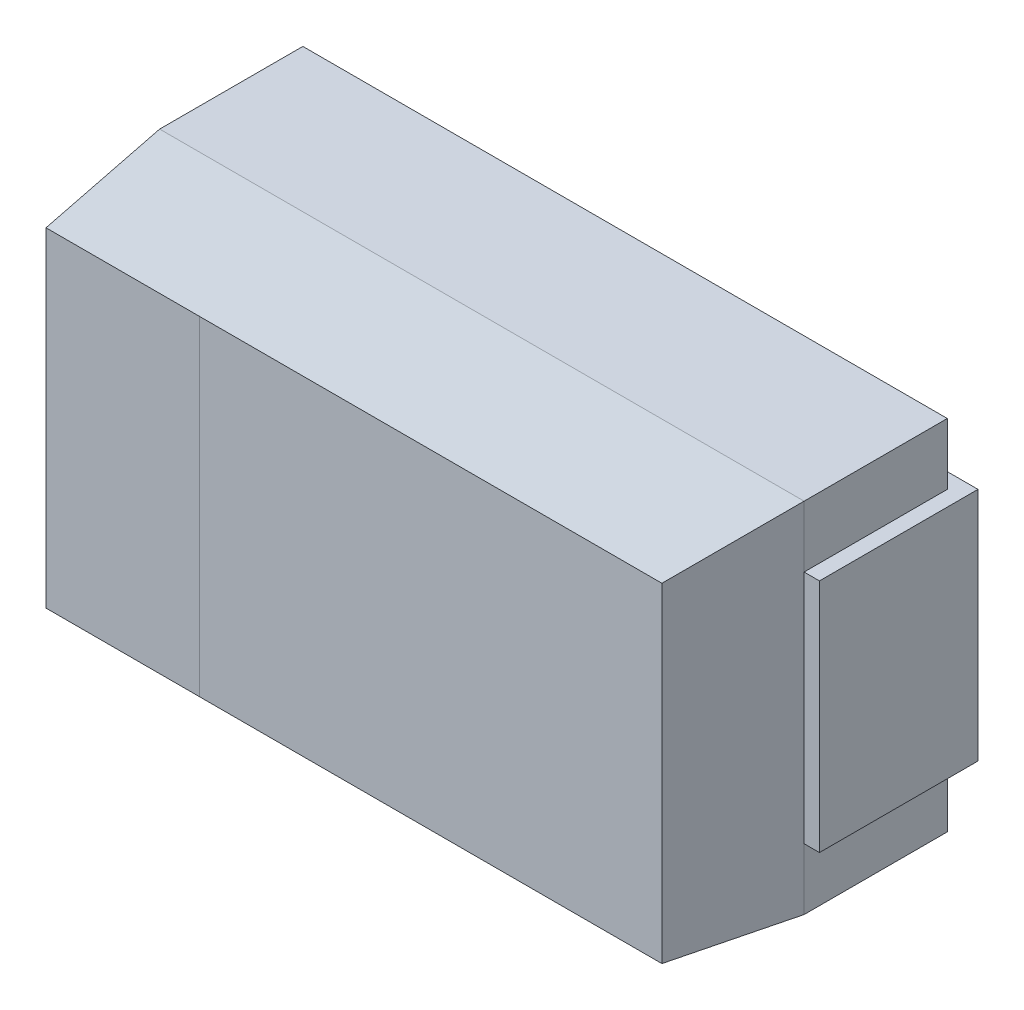
ISO-10303-21;
HEADER;
FILE_DESCRIPTION(('STEP AP214'),'2;1');
FILE_NAME('part.step','',(''),(''),'','','');
FILE_SCHEMA(('AUTOMOTIVE_DESIGN { 1 0 10303 214 1 1 1 1 }'));
ENDSEC;
DATA;
#1=APPLICATION_CONTEXT('core data for automotive mechanical design processes');
#2=APPLICATION_PROTOCOL_DEFINITION('international standard','automotive_design',2000,#1);
#3=PRODUCT_CONTEXT('',#1,'mechanical');
#4=PRODUCT('Part','Part','',(#3));
#5=PRODUCT_RELATED_PRODUCT_CATEGORY('part','',(#4));
#6=PRODUCT_DEFINITION_FORMATION('','',#4);
#7=PRODUCT_DEFINITION_CONTEXT('part definition',#1,'design');
#8=PRODUCT_DEFINITION('design','',#6,#7);
#9=PRODUCT_DEFINITION_SHAPE('','',#8);
#10=(LENGTH_UNIT() NAMED_UNIT(*) SI_UNIT(.MILLI.,.METRE.));
#11=(NAMED_UNIT(*) PLANE_ANGLE_UNIT() SI_UNIT($,.RADIAN.));
#12=(NAMED_UNIT(*) SI_UNIT($,.STERADIAN.) SOLID_ANGLE_UNIT());
#13=UNCERTAINTY_MEASURE_WITH_UNIT(LENGTH_MEASURE(1.E-05),#10,'distance_accuracy_value','');
#14=(GEOMETRIC_REPRESENTATION_CONTEXT(3) GLOBAL_UNCERTAINTY_ASSIGNED_CONTEXT((#13)) GLOBAL_UNIT_ASSIGNED_CONTEXT((#10,
#11,#12)) REPRESENTATION_CONTEXT('',''));
#15=CARTESIAN_POINT('',(0.,0.,0.));
#16=DIRECTION('',(0.,0.,1.));
#17=DIRECTION('',(1.,0.,0.));
#18=AXIS2_PLACEMENT_3D('',#15,#16,#17);
#19=CARTESIAN_POINT('',(-3.301,-1.151,0.));
#20=DIRECTION('',(0.,0.,-1.));
#21=DIRECTION('',(0.,1.,0.));
#22=AXIS2_PLACEMENT_3D('',#19,#20,#21);
#23=PLANE('',#22);
#24=DIRECTION('',(0.,1.,0.));
#25=VECTOR('',#24,1.);
#26=CARTESIAN_POINT('',(-1.7,0.,0.));
#27=LINE('',#26,#25);
#28=CARTESIAN_POINT('',(-1.7,-1.15,0.));
#29=VERTEX_POINT('',#28);
#30=CARTESIAN_POINT('',(-1.7,1.15,0.));
#31=VERTEX_POINT('',#30);
#32=EDGE_CURVE('E316',#29,#31,#27,.T.);
#33=ORIENTED_EDGE('',*,*,#32,.F.);
#34=DIRECTION('',(1.,0.,0.));
#35=VECTOR('',#34,1.);
#36=CARTESIAN_POINT('',(-2.5,-1.15,0.));
#37=LINE('',#36,#35);
#38=CARTESIAN_POINT('',(-3.3,-1.15,0.));
#39=VERTEX_POINT('',#38);
#40=EDGE_CURVE('E317',#39,#29,#37,.T.);
#41=ORIENTED_EDGE('',*,*,#40,.F.);
#42=DIRECTION('',(0.,-1.,0.));
#43=VECTOR('',#42,1.);
#44=CARTESIAN_POINT('',(-3.3,0.,0.));
#45=LINE('',#44,#43);
#46=CARTESIAN_POINT('',(-3.3,1.15,0.));
#47=VERTEX_POINT('',#46);
#48=EDGE_CURVE('E320',#47,#39,#45,.T.);
#49=ORIENTED_EDGE('',*,*,#48,.F.);
#50=DIRECTION('',(1.,0.,0.));
#51=VECTOR('',#50,1.);
#52=CARTESIAN_POINT('',(-2.5,1.15,0.));
#53=LINE('',#52,#51);
#54=EDGE_CURVE('E323',#47,#31,#53,.T.);
#55=ORIENTED_EDGE('',*,*,#54,.T.);
#56=EDGE_LOOP('',(#33,#41,#49,#55));
#57=FACE_BOUND('',#56,.T.);
#58=ADVANCED_FACE('F16',(#57),#23,.T.);
#59=CARTESIAN_POINT('',(-3.3,1.151,-0.001));
#60=DIRECTION('',(-1.,0.,0.));
#61=DIRECTION('',(0.,-1.,0.));
#62=AXIS2_PLACEMENT_3D('',#59,#60,#61);
#63=PLANE('',#62);
#64=DIRECTION('',(0.,-1.,0.));
#65=VECTOR('',#64,1.);
#66=CARTESIAN_POINT('',(-3.3,0.,1.55));
#67=LINE('',#66,#65);
#68=CARTESIAN_POINT('',(-3.3,1.15,1.55));
#69=VERTEX_POINT('',#68);
#70=CARTESIAN_POINT('',(-3.3,-1.15,1.55));
#71=VERTEX_POINT('',#70);
#72=EDGE_CURVE('E276',#69,#71,#67,.T.);
#73=ORIENTED_EDGE('',*,*,#72,.F.);
#74=DIRECTION('',(0.,0.,1.));
#75=VECTOR('',#74,1.);
#76=CARTESIAN_POINT('',(-3.3,1.15,0.775));
#77=LINE('',#76,#75);
#78=EDGE_CURVE('E302',#47,#69,#77,.T.);
#79=ORIENTED_EDGE('',*,*,#78,.F.);
#80=ORIENTED_EDGE('',*,*,#48,.T.);
#81=DIRECTION('',(0.,0.,-1.));
#82=VECTOR('',#81,1.);
#83=CARTESIAN_POINT('',(-3.3,-1.15,0.775));
#84=LINE('',#83,#82);
#85=EDGE_CURVE('E313',#71,#39,#84,.T.);
#86=ORIENTED_EDGE('',*,*,#85,.F.);
#87=EDGE_LOOP('',(#73,#79,#80,#86));
#88=FACE_BOUND('',#87,.T.);
#89=ADVANCED_FACE('F793',(#88),#63,.T.);
#90=CARTESIAN_POINT('',(-3.301,-1.15,-0.001));
#91=DIRECTION('',(0.,-1.,0.));
#92=DIRECTION('',(1.,0.,0.));
#93=AXIS2_PLACEMENT_3D('',#90,#91,#92);
#94=PLANE('',#93);
#95=DIRECTION('',(1.,0.,0.));
#96=VECTOR('',#95,1.);
#97=CARTESIAN_POINT('',(-3.225,-1.15,1.55));
#98=LINE('',#97,#96);
#99=CARTESIAN_POINT('',(-3.15,-1.15,1.55));
#100=VERTEX_POINT('',#99);
#101=EDGE_CURVE('E273',#71,#100,#98,.T.);
#102=ORIENTED_EDGE('',*,*,#101,.F.);
#103=ORIENTED_EDGE('',*,*,#85,.T.);
#104=ORIENTED_EDGE('',*,*,#40,.T.);
#105=DIRECTION('',(0.,0.,-1.));
#106=VECTOR('',#105,1.);
#107=CARTESIAN_POINT('',(-1.7,-1.15,0.075));
#108=LINE('',#107,#106);
#109=CARTESIAN_POINT('',(-1.7,-1.15,0.15));
#110=VERTEX_POINT('',#109);
#111=EDGE_CURVE('E306',#110,#29,#108,.T.);
#112=ORIENTED_EDGE('',*,*,#111,.F.);
#113=DIRECTION('',(1.,0.,0.));
#114=VECTOR('',#113,1.);
#115=CARTESIAN_POINT('',(0.,-1.15,0.15));
#116=LINE('',#115,#114);
#117=CARTESIAN_POINT('',(-3.15,-1.15,0.15));
#118=VERTEX_POINT('',#117);
#119=EDGE_CURVE('E226',#118,#110,#116,.T.);
#120=ORIENTED_EDGE('',*,*,#119,.F.);
#121=DIRECTION('',(0.,0.,-1.));
#122=VECTOR('',#121,1.);
#123=CARTESIAN_POINT('',(-3.15,-1.15,0.85));
#124=LINE('',#123,#122);
#125=EDGE_CURVE('E264',#100,#118,#124,.T.);
#126=ORIENTED_EDGE('',*,*,#125,.F.);
#127=EDGE_LOOP('',(#102,#103,#104,#112,#120,#126));
#128=FACE_BOUND('',#127,.T.);
#129=ADVANCED_FACE('F611',(#128),#94,.T.);
#130=CARTESIAN_POINT('',(-1.7,-1.151,-0.001));
#131=DIRECTION('',(1.,0.,0.));
#132=DIRECTION('',(0.,1.,0.));
#133=AXIS2_PLACEMENT_3D('',#130,#131,#132);
#134=PLANE('',#133);
#135=DIRECTION('',(0.,1.,0.));
#136=VECTOR('',#135,1.);
#137=CARTESIAN_POINT('',(-1.7,0.,0.15));
#138=LINE('',#137,#136);
#139=CARTESIAN_POINT('',(-1.7,1.15,0.15));
#140=VERTEX_POINT('',#139);
#141=EDGE_CURVE('E222',#110,#140,#138,.T.);
#142=ORIENTED_EDGE('',*,*,#141,.F.);
#143=ORIENTED_EDGE('',*,*,#111,.T.);
#144=ORIENTED_EDGE('',*,*,#32,.T.);
#145=DIRECTION('',(0.,0.,-1.));
#146=VECTOR('',#145,1.);
#147=CARTESIAN_POINT('',(-1.7,1.15,0.775));
#148=LINE('',#147,#146);
#149=EDGE_CURVE('E305',#140,#31,#148,.T.);
#150=ORIENTED_EDGE('',*,*,#149,.F.);
#151=EDGE_LOOP('',(#142,#143,#144,#150));
#152=FACE_BOUND('',#151,.T.);
#153=ADVANCED_FACE('F613',(#152),#134,.T.);
#154=CARTESIAN_POINT('',(-1.699,1.15,-0.001));
#155=DIRECTION('',(0.,1.,0.));
#156=DIRECTION('',(-1.,0.,0.));
#157=AXIS2_PLACEMENT_3D('',#154,#155,#156);
#158=PLANE('',#157);
#159=DIRECTION('',(-1.,0.,0.));
#160=VECTOR('',#159,1.);
#161=CARTESIAN_POINT('',(0.,1.15,0.15));
#162=LINE('',#161,#160);
#163=CARTESIAN_POINT('',(-3.15,1.15,0.15));
#164=VERTEX_POINT('',#163);
#165=EDGE_CURVE('E225',#140,#164,#162,.T.);
#166=ORIENTED_EDGE('',*,*,#165,.F.);
#167=ORIENTED_EDGE('',*,*,#149,.T.);
#168=ORIENTED_EDGE('',*,*,#54,.F.);
#169=ORIENTED_EDGE('',*,*,#78,.T.);
#170=DIRECTION('',(-1.,0.,0.));
#171=VECTOR('',#170,1.);
#172=CARTESIAN_POINT('',(-3.225,1.15,1.55));
#173=LINE('',#172,#171);
#174=CARTESIAN_POINT('',(-3.15,1.15,1.55));
#175=VERTEX_POINT('',#174);
#176=EDGE_CURVE('E266',#175,#69,#173,.T.);
#177=ORIENTED_EDGE('',*,*,#176,.F.);
#178=DIRECTION('',(0.,0.,1.));
#179=VECTOR('',#178,1.);
#180=CARTESIAN_POINT('',(-3.15,1.15,0.85));
#181=LINE('',#180,#179);
#182=EDGE_CURVE('E235',#164,#175,#181,.T.);
#183=ORIENTED_EDGE('',*,*,#182,.F.);
#184=EDGE_LOOP('',(#166,#167,#168,#169,#177,#183));
#185=FACE_BOUND('',#184,.T.);
#186=ADVANCED_FACE('F614',(#185),#158,.T.);
#187=CARTESIAN_POINT('',(-3.301,1.151,1.55));
#188=DIRECTION('',(0.,0.,1.));
#189=DIRECTION('',(0.,-1.,0.));
#190=AXIS2_PLACEMENT_3D('',#187,#188,#189);
#191=PLANE('',#190);
#192=DIRECTION('',(0.,-1.,0.));
#193=VECTOR('',#192,1.);
#194=CARTESIAN_POINT('',(-3.15,0.,1.55));
#195=LINE('',#194,#193);
#196=EDGE_CURVE('E246',#175,#100,#195,.T.);
#197=ORIENTED_EDGE('',*,*,#196,.F.);
#198=ORIENTED_EDGE('',*,*,#176,.T.);
#199=ORIENTED_EDGE('',*,*,#72,.T.);
#200=ORIENTED_EDGE('',*,*,#101,.T.);
#201=EDGE_LOOP('',(#197,#198,#199,#200));
#202=FACE_BOUND('',#201,.T.);
#203=ADVANCED_FACE('F590',(#202),#191,.T.);
#204=CARTESIAN_POINT('',(-3.15,-1.149,1.551));
#205=DIRECTION('',(-1.,0.,0.));
#206=DIRECTION('',(0.,0.,-1.));
#207=AXIS2_PLACEMENT_3D('',#204,#205,#206);
#208=PLANE('',#207);
#209=DIRECTION('',(0.,0.,-1.));
#210=VECTOR('',#209,1.);
#211=CARTESIAN_POINT('',(-3.15,-1.75,0.85));
#212=LINE('',#211,#210);
#213=CARTESIAN_POINT('',(-3.15,-1.75,1.55));
#214=VERTEX_POINT('',#213);
#215=CARTESIAN_POINT('',(-3.15,-1.75,0.15));
#216=VERTEX_POINT('',#215);
#217=EDGE_CURVE('E216',#214,#216,#212,.T.);
#218=ORIENTED_EDGE('',*,*,#217,.F.);
#219=DIRECTION('',(0.,-1.,0.));
#220=VECTOR('',#219,1.);
#221=CARTESIAN_POINT('',(-3.15,0.,1.55));
#222=LINE('',#221,#220);
#223=EDGE_CURVE('E258',#100,#214,#222,.T.);
#224=ORIENTED_EDGE('',*,*,#223,.F.);
#225=ORIENTED_EDGE('',*,*,#125,.T.);
#226=DIRECTION('',(0.,1.,0.));
#227=VECTOR('',#226,1.);
#228=CARTESIAN_POINT('',(-3.15,0.,0.15));
#229=LINE('',#228,#227);
#230=EDGE_CURVE('E229',#216,#118,#229,.T.);
#231=ORIENTED_EDGE('',*,*,#230,.F.);
#232=EDGE_LOOP('',(#218,#224,#225,#231));
#233=FACE_BOUND('',#232,.T.);
#234=ADVANCED_FACE('F596',(#233),#208,.T.);
#235=CARTESIAN_POINT('',(-3.15,1.751,1.551));
#236=DIRECTION('',(-1.,0.,0.));
#237=DIRECTION('',(0.,0.,-1.));
#238=AXIS2_PLACEMENT_3D('',#235,#236,#237);
#239=PLANE('',#238);
#240=DIRECTION('',(0.,0.,1.));
#241=VECTOR('',#240,1.);
#242=CARTESIAN_POINT('',(-3.15,1.75,0.85));
#243=LINE('',#242,#241);
#244=CARTESIAN_POINT('',(-3.15,1.75,0.15));
#245=VERTEX_POINT('',#244);
#246=CARTESIAN_POINT('',(-3.15,1.75,1.55));
#247=VERTEX_POINT('',#246);
#248=EDGE_CURVE('E209',#245,#247,#243,.T.);
#249=ORIENTED_EDGE('',*,*,#248,.F.);
#250=DIRECTION('',(0.,1.,0.));
#251=VECTOR('',#250,1.);
#252=CARTESIAN_POINT('',(-3.15,0.,0.15));
#253=LINE('',#252,#251);
#254=EDGE_CURVE('E221',#164,#245,#253,.T.);
#255=ORIENTED_EDGE('',*,*,#254,.F.);
#256=ORIENTED_EDGE('',*,*,#182,.T.);
#257=DIRECTION('',(0.,-1.,0.));
#258=VECTOR('',#257,1.);
#259=CARTESIAN_POINT('',(-3.15,0.,1.55));
#260=LINE('',#259,#258);
#261=EDGE_CURVE('E220',#247,#175,#260,.T.);
#262=ORIENTED_EDGE('',*,*,#261,.F.);
#263=EDGE_LOOP('',(#249,#255,#256,#262));
#264=FACE_BOUND('',#263,.T.);
#265=ADVANCED_FACE('F586',(#264),#239,.T.);
#266=CARTESIAN_POINT('',(-3.151,-1.751,0.15));
#267=DIRECTION('',(0.,0.,-1.));
#268=DIRECTION('',(0.,1.,0.));
#269=AXIS2_PLACEMENT_3D('',#266,#267,#268);
#270=PLANE('',#269);
#271=DIRECTION('',(-1.,0.,0.));
#272=VECTOR('',#271,1.);
#273=CARTESIAN_POINT('',(0.,1.75,0.15));
#274=LINE('',#273,#272);
#275=CARTESIAN_POINT('',(3.15,1.75,0.15));
#276=VERTEX_POINT('',#275);
#277=EDGE_CURVE('E210',#276,#245,#274,.T.);
#278=ORIENTED_EDGE('',*,*,#277,.F.);
#279=DIRECTION('',(0.,-1.,0.));
#280=VECTOR('',#279,1.);
#281=CARTESIAN_POINT('',(3.15,0.,0.15));
#282=LINE('',#281,#280);
#283=CARTESIAN_POINT('',(3.15,1.15,0.15));
#284=VERTEX_POINT('',#283);
#285=EDGE_CURVE('E217',#276,#284,#282,.T.);
#286=ORIENTED_EDGE('',*,*,#285,.T.);
#287=DIRECTION('',(-1.,0.,0.));
#288=VECTOR('',#287,1.);
#289=CARTESIAN_POINT('',(0.,1.15,0.15));
#290=LINE('',#289,#288);
#291=CARTESIAN_POINT('',(1.7,1.15,0.15));
#292=VERTEX_POINT('',#291);
#293=EDGE_CURVE('E233',#284,#292,#290,.T.);
#294=ORIENTED_EDGE('',*,*,#293,.T.);
#295=DIRECTION('',(0.,1.,0.));
#296=VECTOR('',#295,1.);
#297=CARTESIAN_POINT('',(1.7,0.,0.15));
#298=LINE('',#297,#296);
#299=CARTESIAN_POINT('',(1.7,-1.15,0.15));
#300=VERTEX_POINT('',#299);
#301=EDGE_CURVE('E203',#300,#292,#298,.T.);
#302=ORIENTED_EDGE('',*,*,#301,.F.);
#303=DIRECTION('',(1.,0.,0.));
#304=VECTOR('',#303,1.);
#305=CARTESIAN_POINT('',(0.,-1.15,0.15));
#306=LINE('',#305,#304);
#307=CARTESIAN_POINT('',(3.15,-1.15,0.15));
#308=VERTEX_POINT('',#307);
#309=EDGE_CURVE('E230',#300,#308,#306,.T.);
#310=ORIENTED_EDGE('',*,*,#309,.T.);
#311=DIRECTION('',(0.,-1.,0.));
#312=VECTOR('',#311,1.);
#313=CARTESIAN_POINT('',(3.15,0.,0.15));
#314=LINE('',#313,#312);
#315=CARTESIAN_POINT('',(3.15,-1.75,0.15));
#316=VERTEX_POINT('',#315);
#317=EDGE_CURVE('E227',#308,#316,#314,.T.);
#318=ORIENTED_EDGE('',*,*,#317,.T.);
#319=DIRECTION('',(1.,0.,0.));
#320=VECTOR('',#319,1.);
#321=CARTESIAN_POINT('',(0.,-1.75,0.15));
#322=LINE('',#321,#320);
#323=EDGE_CURVE('E213',#216,#316,#322,.T.);
#324=ORIENTED_EDGE('',*,*,#323,.F.);
#325=ORIENTED_EDGE('',*,*,#230,.T.);
#326=ORIENTED_EDGE('',*,*,#119,.T.);
#327=ORIENTED_EDGE('',*,*,#141,.T.);
#328=ORIENTED_EDGE('',*,*,#165,.T.);
#329=ORIENTED_EDGE('',*,*,#254,.T.);
#330=EDGE_LOOP('',(#278,#286,#294,#302,#310,#318,#324,#325,#326,#327,#328,#329));
#331=FACE_BOUND('',#330,.T.);
#332=ADVANCED_FACE('F364',(#331),#270,.T.);
#333=CARTESIAN_POINT('',(-3.00988869592355,1.751,2.80099378639685));
#334=DIRECTION('',(-0.993786396851058,0.,0.111304076447324));
#335=DIRECTION('',(-0.111304076447324,0.,-0.993786396851058));
#336=AXIS2_PLACEMENT_3D('',#333,#334,#335);
#337=PLANE('',#336);
#338=CARTESIAN_POINT('',(-3.00977877504582,1.61,2.802));
#339=DIRECTION('',(0.,-1.,0.));
#340=VECTOR('',#339,1.);
#341=LINE('',#338,#340);
#342=CARTESIAN_POINT('',(-3.0099631291743,1.61,2.80099587046752));
#343=VERTEX_POINT('',#342);
#344=CARTESIAN_POINT('',(-3.00992625834861,-1.61,2.80099587046752));
#345=VERTEX_POINT('',#344);
#346=EDGE_CURVE('E347',#343,#345,#341,.T.);
#347=ORIENTED_EDGE('',*,*,#346,.F.);
#348=CARTESIAN_POINT('',(-3.01,1.61,2.8));
#349=DIRECTION('',(-0.110620966319341,0.110620966319337,-0.987687199279788));
#350=VECTOR('',#349,1.);
#351=LINE('',#348,#350);
#352=EDGE_CURVE('E176',#343,#247,#351,.T.);
#353=ORIENTED_EDGE('',*,*,#352,.T.);
#354=ORIENTED_EDGE('',*,*,#261,.T.);
#355=ORIENTED_EDGE('',*,*,#196,.T.);
#356=ORIENTED_EDGE('',*,*,#223,.T.);
#357=CARTESIAN_POINT('',(-3.15,-1.75,1.55));
#358=DIRECTION('',(0.110620966319341,0.110620966319336,0.987687199279788));
#359=VECTOR('',#358,1.);
#360=LINE('',#357,#359);
#361=EDGE_CURVE('E261',#214,#345,#360,.T.);
#362=ORIENTED_EDGE('',*,*,#361,.T.);
#363=EDGE_LOOP('',(#347,#353,#354,#355,#356,#362));
#364=FACE_BOUND('',#363,.T.);
#365=ADVANCED_FACE('F353',(#364),#337,.T.);
#366=CARTESIAN_POINT('',(-3.151,-1.75,1.551));
#367=DIRECTION('',(0.,-1.,0.));
#368=DIRECTION('',(0.,0.,-1.));
#369=AXIS2_PLACEMENT_3D('',#366,#367,#368);
#370=PLANE('',#369);
#371=ORIENTED_EDGE('',*,*,#323,.T.);
#372=DIRECTION('',(0.,0.,-1.));
#373=VECTOR('',#372,1.);
#374=CARTESIAN_POINT('',(3.15,-1.75,0.85));
#375=LINE('',#374,#373);
#376=CARTESIAN_POINT('',(3.15,-1.75,1.55));
#377=VERTEX_POINT('',#376);
#378=EDGE_CURVE('E455',#377,#316,#375,.T.);
#379=ORIENTED_EDGE('',*,*,#378,.F.);
#380=DIRECTION('',(1.,0.,0.));
#381=VECTOR('',#380,1.);
#382=CARTESIAN_POINT('',(0.,-1.75,1.55));
#383=LINE('',#382,#381);
#384=EDGE_CURVE('E249',#214,#377,#383,.T.);
#385=ORIENTED_EDGE('',*,*,#384,.F.);
#386=ORIENTED_EDGE('',*,*,#217,.T.);
#387=EDGE_LOOP('',(#371,#379,#385,#386));
#388=FACE_BOUND('',#387,.T.);
#389=ADVANCED_FACE('F363',(#388),#370,.T.);
#390=CARTESIAN_POINT('',(-3.151,1.75,0.149));
#391=DIRECTION('',(0.,1.,0.));
#392=DIRECTION('',(0.,0.,1.));
#393=AXIS2_PLACEMENT_3D('',#390,#391,#392);
#394=PLANE('',#393);
#395=ORIENTED_EDGE('',*,*,#277,.T.);
#396=ORIENTED_EDGE('',*,*,#248,.T.);
#397=DIRECTION('',(-1.,0.,0.));
#398=VECTOR('',#397,1.);
#399=CARTESIAN_POINT('',(0.,1.75,1.55));
#400=LINE('',#399,#398);
#401=CARTESIAN_POINT('',(3.15,1.75,1.55));
#402=VERTEX_POINT('',#401);
#403=EDGE_CURVE('E236',#402,#247,#400,.T.);
#404=ORIENTED_EDGE('',*,*,#403,.F.);
#405=DIRECTION('',(0.,0.,1.));
#406=VECTOR('',#405,1.);
#407=CARTESIAN_POINT('',(3.15,1.75,0.85));
#408=LINE('',#407,#406);
#409=EDGE_CURVE('E202',#276,#402,#408,.T.);
#410=ORIENTED_EDGE('',*,*,#409,.F.);
#411=EDGE_LOOP('',(#395,#396,#404,#410));
#412=FACE_BOUND('',#411,.T.);
#413=ADVANCED_FACE('F583',(#412),#394,.T.);
#414=CARTESIAN_POINT('',(1.7,1.151,-0.001));
#415=DIRECTION('',(-1.,0.,0.));
#416=DIRECTION('',(0.,-1.,0.));
#417=AXIS2_PLACEMENT_3D('',#414,#415,#416);
#418=PLANE('',#417);
#419=ORIENTED_EDGE('',*,*,#301,.T.);
#420=DIRECTION('',(0.,0.,-1.));
#421=VECTOR('',#420,1.);
#422=CARTESIAN_POINT('',(1.7,1.15,0.075));
#423=LINE('',#422,#421);
#424=CARTESIAN_POINT('',(1.7,1.15,0.));
#425=VERTEX_POINT('',#424);
#426=EDGE_CURVE('E200',#292,#425,#423,.T.);
#427=ORIENTED_EDGE('',*,*,#426,.T.);
#428=DIRECTION('',(0.,1.,0.));
#429=VECTOR('',#428,1.);
#430=CARTESIAN_POINT('',(1.7,0.,0.));
#431=LINE('',#430,#429);
#432=CARTESIAN_POINT('',(1.7,-1.15,0.));
#433=VERTEX_POINT('',#432);
#434=EDGE_CURVE('E194',#433,#425,#431,.T.);
#435=ORIENTED_EDGE('',*,*,#434,.F.);
#436=DIRECTION('',(0.,0.,1.));
#437=VECTOR('',#436,1.);
#438=CARTESIAN_POINT('',(1.7,-1.15,0.075));
#439=LINE('',#438,#437);
#440=EDGE_CURVE('E206',#433,#300,#439,.T.);
#441=ORIENTED_EDGE('',*,*,#440,.T.);
#442=EDGE_LOOP('',(#419,#427,#435,#441));
#443=FACE_BOUND('',#442,.T.);
#444=ADVANCED_FACE('F571',(#443),#418,.T.);
#445=CARTESIAN_POINT('',(3.15,1.751,0.149));
#446=DIRECTION('',(1.,0.,0.));
#447=DIRECTION('',(0.,0.,1.));
#448=AXIS2_PLACEMENT_3D('',#445,#446,#447);
#449=PLANE('',#448);
#450=ORIENTED_EDGE('',*,*,#409,.T.);
#451=DIRECTION('',(0.,-1.,0.));
#452=VECTOR('',#451,1.);
#453=CARTESIAN_POINT('',(3.15,1.45,1.55));
#454=LINE('',#453,#452);
#455=CARTESIAN_POINT('',(3.15,1.15,1.55));
#456=VERTEX_POINT('',#455);
#457=EDGE_CURVE('E468',#402,#456,#454,.T.);
#458=ORIENTED_EDGE('',*,*,#457,.T.);
#459=DIRECTION('',(0.,0.,1.));
#460=VECTOR('',#459,1.);
#461=CARTESIAN_POINT('',(3.15,1.15,0.775));
#462=LINE('',#461,#460);
#463=EDGE_CURVE('E562',#284,#456,#462,.T.);
#464=ORIENTED_EDGE('',*,*,#463,.F.);
#465=ORIENTED_EDGE('',*,*,#285,.F.);
#466=EDGE_LOOP('',(#450,#458,#464,#465));
#467=FACE_BOUND('',#466,.T.);
#468=ADVANCED_FACE('F577',(#467),#449,.T.);
#469=CARTESIAN_POINT('',(3.15,-1.149,0.149));
#470=DIRECTION('',(1.,0.,0.));
#471=DIRECTION('',(0.,0.,1.));
#472=AXIS2_PLACEMENT_3D('',#469,#470,#471);
#473=PLANE('',#472);
#474=ORIENTED_EDGE('',*,*,#378,.T.);
#475=ORIENTED_EDGE('',*,*,#317,.F.);
#476=DIRECTION('',(0.,0.,-1.));
#477=VECTOR('',#476,1.);
#478=CARTESIAN_POINT('',(3.15,-1.15,0.775));
#479=LINE('',#478,#477);
#480=CARTESIAN_POINT('',(3.15,-1.15,1.55));
#481=VERTEX_POINT('',#480);
#482=EDGE_CURVE('E164',#481,#308,#479,.T.);
#483=ORIENTED_EDGE('',*,*,#482,.F.);
#484=DIRECTION('',(0.,-1.,0.));
#485=VECTOR('',#484,1.);
#486=CARTESIAN_POINT('',(3.15,-1.45,1.55));
#487=LINE('',#486,#485);
#488=EDGE_CURVE('E463',#481,#377,#487,.T.);
#489=ORIENTED_EDGE('',*,*,#488,.T.);
#490=EDGE_LOOP('',(#474,#475,#483,#489));
#491=FACE_BOUND('',#490,.T.);
#492=ADVANCED_FACE('F401',(#491),#473,.T.);
#493=CARTESIAN_POINT('',(-3.011,1.611,2.802));
#494=DIRECTION('',(0.,0.,1.));
#495=DIRECTION('',(0.,-1.,0.));
#496=AXIS2_PLACEMENT_3D('',#493,#494,#495);
#497=PLANE('',#496);
#498=CARTESIAN_POINT('',(-3.01,1.60977877504582,2.80197522280513));
#499=DIRECTION('',(1.,0.,0.));
#500=VECTOR('',#499,1.);
#501=LINE('',#498,#500);
#502=CARTESIAN_POINT('',(-1.51,1.61,2.8008));
#503=VERTEX_POINT('',#502);
#504=EDGE_CURVE('E157',#343,#503,#501,.T.);
#505=ORIENTED_EDGE('',*,*,#504,.F.);
#506=ORIENTED_EDGE('',*,*,#346,.T.);
#507=CARTESIAN_POINT('',(-1.51,-1.60977877504582,2.80197522280513));
#508=DIRECTION('',(-1.,0.,0.));
#509=VECTOR('',#508,1.);
#510=LINE('',#507,#509);
#511=CARTESIAN_POINT('',(-1.51,-1.61,2.8008));
#512=VERTEX_POINT('',#511);
#513=EDGE_CURVE('E148',#512,#345,#510,.T.);
#514=ORIENTED_EDGE('',*,*,#513,.F.);
#515=CARTESIAN_POINT('',(-1.51,1.61,2.8));
#516=DIRECTION('',(0.,-1.,0.));
#517=VECTOR('',#516,1.);
#518=LINE('',#515,#517);
#519=EDGE_CURVE('E153',#503,#512,#518,.T.);
#520=ORIENTED_EDGE('',*,*,#519,.F.);
#521=EDGE_LOOP('',(#505,#506,#514,#520));
#522=FACE_BOUND('',#521,.T.);
#523=ADVANCED_FACE('F156',(#522),#497,.T.);
#524=CARTESIAN_POINT('',(-3.151,-1.60988869592355,2.80099378639685));
#525=DIRECTION('',(0.,-0.993786396851058,0.111304076447323));
#526=DIRECTION('',(0.,-0.111304076447323,-0.993786396851058));
#527=AXIS2_PLACEMENT_3D('',#524,#525,#526);
#528=PLANE('',#527);
#529=ORIENTED_EDGE('',*,*,#384,.T.);
#530=CARTESIAN_POINT('',(3.15,-1.75,1.55));
#531=DIRECTION('',(-0.110620966319337,0.110620966319341,0.987687199279788));
#532=VECTOR('',#531,1.);
#533=LINE('',#530,#532);
#534=CARTESIAN_POINT('',(3.01,-1.61,2.8));
#535=VERTEX_POINT('',#534);
#536=EDGE_CURVE('E180',#377,#535,#533,.T.);
#537=ORIENTED_EDGE('',*,*,#536,.T.);
#538=DIRECTION('',(1.,0.,0.));
#539=VECTOR('',#538,1.);
#540=CARTESIAN_POINT('',(0.75,-1.61,2.8));
#541=LINE('',#540,#539);
#542=EDGE_CURVE('E163',#512,#535,#541,.T.);
#543=ORIENTED_EDGE('',*,*,#542,.F.);
#544=ORIENTED_EDGE('',*,*,#513,.T.);
#545=ORIENTED_EDGE('',*,*,#361,.F.);
#546=EDGE_LOOP('',(#529,#537,#543,#544,#545));
#547=FACE_BOUND('',#546,.T.);
#548=ADVANCED_FACE('F400',(#547),#528,.T.);
#549=CARTESIAN_POINT('',(-3.151,1.75011130407645,1.54900621360315));
#550=DIRECTION('',(0.,0.993786396851058,0.111304076447323));
#551=DIRECTION('',(0.,-0.111304076447323,0.993786396851058));
#552=AXIS2_PLACEMENT_3D('',#549,#550,#551);
#553=PLANE('',#552);
#554=ORIENTED_EDGE('',*,*,#403,.T.);
#555=ORIENTED_EDGE('',*,*,#352,.F.);
#556=ORIENTED_EDGE('',*,*,#504,.T.);
#557=DIRECTION('',(-1.,0.,0.));
#558=VECTOR('',#557,1.);
#559=CARTESIAN_POINT('',(0.75,1.61,2.8));
#560=LINE('',#559,#558);
#561=CARTESIAN_POINT('',(3.01,1.61,2.8));
#562=VERTEX_POINT('',#561);
#563=EDGE_CURVE('E173',#562,#503,#560,.T.);
#564=ORIENTED_EDGE('',*,*,#563,.F.);
#565=CARTESIAN_POINT('',(3.01,1.61,2.8));
#566=DIRECTION('',(0.110620966319336,0.110620966319341,-0.987687199279788));
#567=VECTOR('',#566,1.);
#568=LINE('',#565,#567);
#569=EDGE_CURVE('E179',#562,#402,#568,.T.);
#570=ORIENTED_EDGE('',*,*,#569,.T.);
#571=EDGE_LOOP('',(#554,#555,#556,#564,#570));
#572=FACE_BOUND('',#571,.T.);
#573=ADVANCED_FACE('F171',(#572),#553,.T.);
#574=CARTESIAN_POINT('',(1.699,-1.151,0.));
#575=DIRECTION('',(0.,0.,-1.));
#576=DIRECTION('',(0.,1.,0.));
#577=AXIS2_PLACEMENT_3D('',#574,#575,#576);
#578=PLANE('',#577);
#579=ORIENTED_EDGE('',*,*,#434,.T.);
#580=DIRECTION('',(-1.,0.,0.));
#581=VECTOR('',#580,1.);
#582=CARTESIAN_POINT('',(2.5,1.15,0.));
#583=LINE('',#582,#581);
#584=CARTESIAN_POINT('',(3.3,1.15,0.));
#585=VERTEX_POINT('',#584);
#586=EDGE_CURVE('E563',#585,#425,#583,.T.);
#587=ORIENTED_EDGE('',*,*,#586,.F.);
#588=DIRECTION('',(0.,1.,0.));
#589=VECTOR('',#588,1.);
#590=CARTESIAN_POINT('',(3.3,0.,0.));
#591=LINE('',#590,#589);
#592=CARTESIAN_POINT('',(3.3,-1.15,0.));
#593=VERTEX_POINT('',#592);
#594=EDGE_CURVE('E186',#593,#585,#591,.T.);
#595=ORIENTED_EDGE('',*,*,#594,.F.);
#596=DIRECTION('',(1.,0.,0.));
#597=VECTOR('',#596,1.);
#598=CARTESIAN_POINT('',(2.5,-1.15,0.));
#599=LINE('',#598,#597);
#600=EDGE_CURVE('E557',#433,#593,#599,.T.);
#601=ORIENTED_EDGE('',*,*,#600,.F.);
#602=EDGE_LOOP('',(#579,#587,#595,#601));
#603=FACE_BOUND('',#602,.T.);
#604=ADVANCED_FACE('F484',(#603),#578,.T.);
#605=CARTESIAN_POINT('',(3.301,1.15,-0.001));
#606=DIRECTION('',(0.,1.,0.));
#607=DIRECTION('',(-1.,0.,0.));
#608=AXIS2_PLACEMENT_3D('',#605,#606,#607);
#609=PLANE('',#608);
#610=DIRECTION('',(1.,0.,0.));
#611=VECTOR('',#610,1.);
#612=CARTESIAN_POINT('',(2.5,1.15,1.55));
#613=LINE('',#612,#611);
#614=CARTESIAN_POINT('',(3.3,1.15,1.55));
#615=VERTEX_POINT('',#614);
#616=EDGE_CURVE('E36',#456,#615,#613,.T.);
#617=ORIENTED_EDGE('',*,*,#616,.T.);
#618=DIRECTION('',(0.,0.,1.));
#619=VECTOR('',#618,1.);
#620=CARTESIAN_POINT('',(3.3,1.15,0.775));
#621=LINE('',#620,#619);
#622=EDGE_CURVE('E189',#585,#615,#621,.T.);
#623=ORIENTED_EDGE('',*,*,#622,.F.);
#624=ORIENTED_EDGE('',*,*,#586,.T.);
#625=ORIENTED_EDGE('',*,*,#426,.F.);
#626=ORIENTED_EDGE('',*,*,#293,.F.);
#627=ORIENTED_EDGE('',*,*,#463,.T.);
#628=EDGE_LOOP('',(#617,#623,#624,#625,#626,#627));
#629=FACE_BOUND('',#628,.T.);
#630=ADVANCED_FACE('F573',(#629),#609,.T.);
#631=CARTESIAN_POINT('',(1.699,-1.15,-0.001));
#632=DIRECTION('',(0.,-1.,0.));
#633=DIRECTION('',(1.,0.,0.));
#634=AXIS2_PLACEMENT_3D('',#631,#632,#633);
#635=PLANE('',#634);
#636=ORIENTED_EDGE('',*,*,#309,.F.);
#637=ORIENTED_EDGE('',*,*,#440,.F.);
#638=ORIENTED_EDGE('',*,*,#600,.T.);
#639=DIRECTION('',(0.,0.,-1.));
#640=VECTOR('',#639,1.);
#641=CARTESIAN_POINT('',(3.3,-1.15,0.775));
#642=LINE('',#641,#640);
#643=CARTESIAN_POINT('',(3.3,-1.15,1.55));
#644=VERTEX_POINT('',#643);
#645=EDGE_CURVE('E472',#644,#593,#642,.T.);
#646=ORIENTED_EDGE('',*,*,#645,.F.);
#647=DIRECTION('',(-1.,0.,0.));
#648=VECTOR('',#647,1.);
#649=CARTESIAN_POINT('',(2.5,-1.15,1.55));
#650=LINE('',#649,#648);
#651=EDGE_CURVE('E549',#644,#481,#650,.T.);
#652=ORIENTED_EDGE('',*,*,#651,.T.);
#653=ORIENTED_EDGE('',*,*,#482,.T.);
#654=EDGE_LOOP('',(#636,#637,#638,#646,#652,#653));
#655=FACE_BOUND('',#654,.T.);
#656=ADVANCED_FACE('F528',(#655),#635,.T.);
#657=CARTESIAN_POINT('',(-1.511,1.611,2.8));
#658=DIRECTION('',(0.,0.,1.));
#659=DIRECTION('',(0.,-1.,0.));
#660=AXIS2_PLACEMENT_3D('',#657,#658,#659);
#661=PLANE('',#660);
#662=DIRECTION('',(0.,-1.,0.));
#663=VECTOR('',#662,1.);
#664=CARTESIAN_POINT('',(3.01,0.,2.8));
#665=LINE('',#664,#663);
#666=EDGE_CURVE('E185',#562,#535,#665,.T.);
#667=ORIENTED_EDGE('',*,*,#666,.F.);
#668=ORIENTED_EDGE('',*,*,#563,.T.);
#669=ORIENTED_EDGE('',*,*,#519,.T.);
#670=ORIENTED_EDGE('',*,*,#542,.T.);
#671=EDGE_LOOP('',(#667,#668,#669,#670));
#672=FACE_BOUND('',#671,.T.);
#673=ADVANCED_FACE('F183',(#672),#661,.T.);
#674=CARTESIAN_POINT('',(3.3,-1.151,-0.001));
#675=DIRECTION('',(1.,0.,0.));
#676=DIRECTION('',(0.,1.,0.));
#677=AXIS2_PLACEMENT_3D('',#674,#675,#676);
#678=PLANE('',#677);
#679=DIRECTION('',(0.,1.,0.));
#680=VECTOR('',#679,1.);
#681=CARTESIAN_POINT('',(3.3,0.,1.55));
#682=LINE('',#681,#680);
#683=EDGE_CURVE('E27',#644,#615,#682,.T.);
#684=ORIENTED_EDGE('',*,*,#683,.F.);
#685=ORIENTED_EDGE('',*,*,#645,.T.);
#686=ORIENTED_EDGE('',*,*,#594,.T.);
#687=ORIENTED_EDGE('',*,*,#622,.T.);
#688=EDGE_LOOP('',(#684,#685,#686,#687));
#689=FACE_BOUND('',#688,.T.);
#690=ADVANCED_FACE('F527',(#689),#678,.T.);
#691=CARTESIAN_POINT('',(3.15011130407645,1.751,1.54900621360315));
#692=DIRECTION('',(0.993786396851058,0.,0.111304076447324));
#693=DIRECTION('',(-0.111304076447324,0.,0.993786396851058));
#694=AXIS2_PLACEMENT_3D('',#691,#692,#693);
#695=PLANE('',#694);
#696=ORIENTED_EDGE('',*,*,#457,.F.);
#697=ORIENTED_EDGE('',*,*,#569,.F.);
#698=ORIENTED_EDGE('',*,*,#666,.T.);
#699=ORIENTED_EDGE('',*,*,#536,.F.);
#700=ORIENTED_EDGE('',*,*,#488,.F.);
#701=DIRECTION('',(0.,-1.,0.));
#702=VECTOR('',#701,1.);
#703=CARTESIAN_POINT('',(3.15,0.,1.55));
#704=LINE('',#703,#702);
#705=EDGE_CURVE('E11',#456,#481,#704,.T.);
#706=ORIENTED_EDGE('',*,*,#705,.F.);
#707=EDGE_LOOP('',(#696,#697,#698,#699,#700,#706));
#708=FACE_BOUND('',#707,.T.);
#709=ADVANCED_FACE('F530',(#708),#695,.T.);
#710=CARTESIAN_POINT('',(3.149,1.151,1.55));
#711=DIRECTION('',(0.,0.,1.));
#712=DIRECTION('',(0.,-1.,0.));
#713=AXIS2_PLACEMENT_3D('',#710,#711,#712);
#714=PLANE('',#713);
#715=ORIENTED_EDGE('',*,*,#705,.T.);
#716=ORIENTED_EDGE('',*,*,#651,.F.);
#717=ORIENTED_EDGE('',*,*,#683,.T.);
#718=ORIENTED_EDGE('',*,*,#616,.F.);
#719=EDGE_LOOP('',(#715,#716,#717,#718));
#720=FACE_BOUND('',#719,.T.);
#721=ADVANCED_FACE('F18',(#720),#714,.T.);
#722=CLOSED_SHELL('',(#58,#89,#129,#153,#186,#203,#234,#265,#332,#365,#389,#413,#444,#468,#492,
#523,#548,#573,#604,#630,#656,#673,#690,#709,#721));
#723=MANIFOLD_SOLID_BREP('B1',#722);
#724=ADVANCED_BREP_SHAPE_REPRESENTATION('',(#18,#723),#14);
#725=SHAPE_DEFINITION_REPRESENTATION(#9,#724);
ENDSEC;
END-ISO-10303-21;
